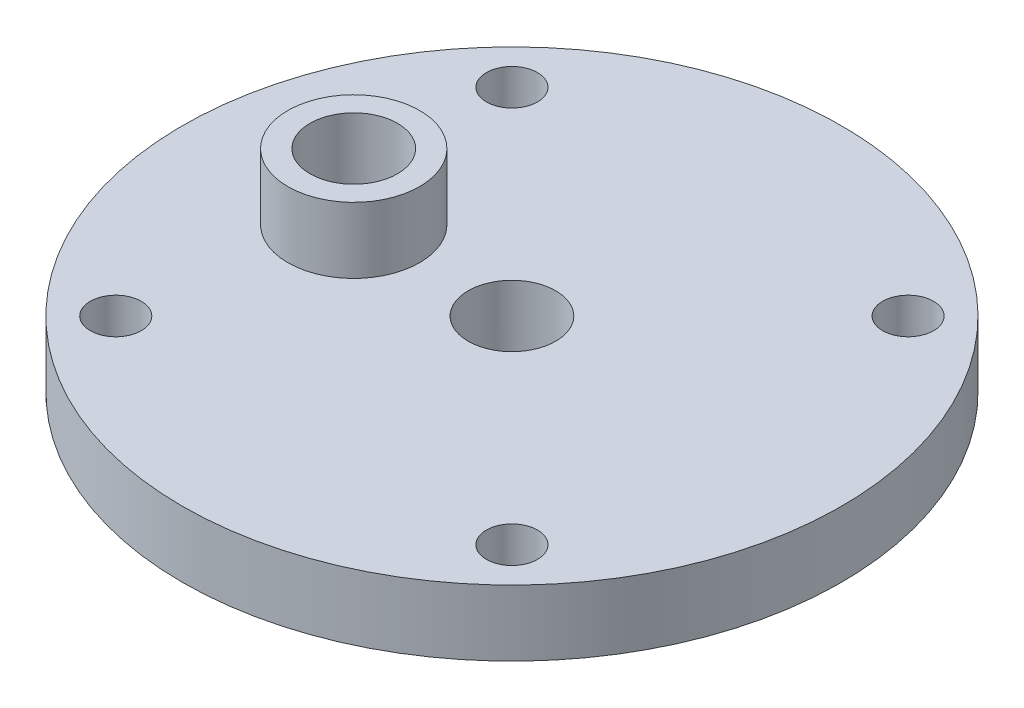
ISO-10303-21;
HEADER;
FILE_DESCRIPTION(('STEP AP214'),'2;1');
FILE_NAME('part.step','',(''),(''),'','','');
FILE_SCHEMA(('AUTOMOTIVE_DESIGN { 1 0 10303 214 1 1 1 1 }'));
ENDSEC;
DATA;
#1=APPLICATION_CONTEXT('core data for automotive mechanical design processes');
#2=APPLICATION_PROTOCOL_DEFINITION('international standard','automotive_design',2000,#1);
#3=PRODUCT_CONTEXT('',#1,'mechanical');
#4=PRODUCT('Part','Part','',(#3));
#5=PRODUCT_RELATED_PRODUCT_CATEGORY('part','',(#4));
#6=PRODUCT_DEFINITION_FORMATION('','',#4);
#7=PRODUCT_DEFINITION_CONTEXT('part definition',#1,'design');
#8=PRODUCT_DEFINITION('design','',#6,#7);
#9=PRODUCT_DEFINITION_SHAPE('','',#8);
#10=(LENGTH_UNIT() NAMED_UNIT(*) SI_UNIT(.MILLI.,.METRE.));
#11=(NAMED_UNIT(*) PLANE_ANGLE_UNIT() SI_UNIT($,.RADIAN.));
#12=(NAMED_UNIT(*) SI_UNIT($,.STERADIAN.) SOLID_ANGLE_UNIT());
#13=UNCERTAINTY_MEASURE_WITH_UNIT(LENGTH_MEASURE(1.E-05),#10,'distance_accuracy_value','');
#14=(GEOMETRIC_REPRESENTATION_CONTEXT(3) GLOBAL_UNCERTAINTY_ASSIGNED_CONTEXT((#13)) GLOBAL_UNIT_ASSIGNED_CONTEXT((#10,
#11,#12)) REPRESENTATION_CONTEXT('',''));
#15=CARTESIAN_POINT('',(0.,0.,0.));
#16=DIRECTION('',(0.,0.,1.));
#17=DIRECTION('',(1.,0.,0.));
#18=AXIS2_PLACEMENT_3D('',#15,#16,#17);
#19=CARTESIAN_POINT('',(0.,0.,0.));
#20=DIRECTION('',(0.,-1.,0.));
#21=DIRECTION('',(0.,0.,-1.));
#22=AXIS2_PLACEMENT_3D('',#19,#20,#21);
#23=PLANE('',#22);
#24=CARTESIAN_POINT('',(0.,0.,-6.34999999999999));
#25=DIRECTION('',(0.,-1.,0.));
#26=DIRECTION('',(0.,0.,-1.));
#27=AXIS2_PLACEMENT_3D('',#24,#25,#26);
#28=ELLIPSE('',#27,0.359210244842765,0.253999999999999);
#29=CARTESIAN_POINT('',(0.,0.,-6.70921024484276));
#30=VERTEX_POINT('',#29);
#31=EDGE_CURVE('E189',#30,#30,#28,.T.);
#32=ORIENTED_EDGE('',*,*,#31,.F.);
#33=EDGE_LOOP('',(#32));
#34=FACE_BOUND('',#33,.T.);
#35=CARTESIAN_POINT('',(-6.34999999999999,0.,0.));
#36=DIRECTION('',(0.,-1.,0.));
#37=DIRECTION('',(-1.,0.,0.));
#38=AXIS2_PLACEMENT_3D('',#35,#36,#37);
#39=ELLIPSE('',#38,0.359210244842765,0.253999999999999);
#40=CARTESIAN_POINT('',(-6.70921024484276,0.,0.));
#41=VERTEX_POINT('',#40);
#42=EDGE_CURVE('E193',#41,#41,#39,.T.);
#43=ORIENTED_EDGE('',*,*,#42,.F.);
#44=EDGE_LOOP('',(#43));
#45=FACE_BOUND('',#44,.T.);
#46=CARTESIAN_POINT('',(0.,0.,6.34999999999999));
#47=DIRECTION('',(0.,-1.,0.));
#48=DIRECTION('',(0.,0.,1.));
#49=AXIS2_PLACEMENT_3D('',#46,#47,#48);
#50=ELLIPSE('',#49,0.359210244842765,0.253999999999999);
#51=CARTESIAN_POINT('',(0.,0.,6.70921024484276));
#52=VERTEX_POINT('',#51);
#53=EDGE_CURVE('E197',#52,#52,#50,.T.);
#54=ORIENTED_EDGE('',*,*,#53,.F.);
#55=EDGE_LOOP('',(#54));
#56=FACE_BOUND('',#55,.T.);
#57=CARTESIAN_POINT('',(6.34999999999999,0.,0.));
#58=DIRECTION('',(0.,-1.,0.));
#59=DIRECTION('',(1.,0.,0.));
#60=AXIS2_PLACEMENT_3D('',#57,#58,#59);
#61=ELLIPSE('',#60,0.359210244842765,0.253999999999999);
#62=CARTESIAN_POINT('',(6.70921024484276,0.,0.));
#63=VERTEX_POINT('',#62);
#64=EDGE_CURVE('E201',#63,#63,#61,.T.);
#65=ORIENTED_EDGE('',*,*,#64,.F.);
#66=EDGE_LOOP('',(#65));
#67=FACE_BOUND('',#66,.T.);
#68=CARTESIAN_POINT('',(0.,0.,0.));
#69=DIRECTION('',(0.,-1.,0.));
#70=DIRECTION('',(0.,0.,-1.));
#71=AXIS2_PLACEMENT_3D('',#68,#69,#70);
#72=CIRCLE('',#71,4.21639999999999);
#73=CARTESIAN_POINT('',(0.,0.,-4.21639999999999));
#74=VERTEX_POINT('',#73);
#75=EDGE_CURVE('E205',#74,#74,#72,.T.);
#76=ORIENTED_EDGE('',*,*,#75,.F.);
#77=EDGE_LOOP('',(#76));
#78=FACE_BOUND('',#77,.T.);
#79=CARTESIAN_POINT('',(0.,0.,0.));
#80=DIRECTION('',(0.,1.,0.));
#81=DIRECTION('',(0.,0.,1.));
#82=AXIS2_PLACEMENT_3D('',#79,#80,#81);
#83=CIRCLE('',#82,15.875);
#84=CARTESIAN_POINT('',(0.,0.,15.875));
#85=VERTEX_POINT('',#84);
#86=EDGE_CURVE('E123',#85,#85,#83,.T.);
#87=ORIENTED_EDGE('',*,*,#86,.F.);
#88=EDGE_LOOP('',(#87));
#89=FACE_BOUND('',#88,.T.);
#90=ADVANCED_FACE('F41',(#34,#45,#56,#67,#78,#89),#23,.T.);
#91=CARTESIAN_POINT('',(0.,14.2875,0.));
#92=DIRECTION('',(0.,1.,0.));
#93=DIRECTION('',(0.,0.,1.));
#94=AXIS2_PLACEMENT_3D('',#91,#92,#93);
#95=CYLINDRICAL_SURFACE('',#94,15.875);
#96=ORIENTED_EDGE('',*,*,#86,.T.);
#97=EDGE_LOOP('',(#96));
#98=FACE_BOUND('',#97,.T.);
#99=CARTESIAN_POINT('',(0.,3.175,0.));
#100=DIRECTION('',(0.,1.,0.));
#101=DIRECTION('',(0.,0.,1.));
#102=AXIS2_PLACEMENT_3D('',#99,#100,#101);
#103=CIRCLE('',#102,15.875);
#104=CARTESIAN_POINT('',(0.,3.175,15.875));
#105=VERTEX_POINT('',#104);
#106=EDGE_CURVE('E119',#105,#105,#103,.T.);
#107=ORIENTED_EDGE('',*,*,#106,.F.);
#108=EDGE_LOOP('',(#107));
#109=FACE_BOUND('',#108,.T.);
#110=ADVANCED_FACE('F179',(#98,#109),#95,.T.);
#111=CARTESIAN_POINT('',(-15.875,3.175,0.));
#112=DIRECTION('',(0.,1.,0.));
#113=DIRECTION('',(0.,0.,1.));
#114=AXIS2_PLACEMENT_3D('',#111,#112,#113);
#115=PLANE('',#114);
#116=CARTESIAN_POINT('',(0.,3.175,-9.52499999999999));
#117=DIRECTION('',(0.,1.,0.));
#118=DIRECTION('',(0.,0.,-1.));
#119=AXIS2_PLACEMENT_3D('',#116,#117,#118);
#120=ELLIPSE('',#119,0.359210244842765,0.253999999999999);
#121=CARTESIAN_POINT('',(0.253988708852886,3.175,-9.52161303224276));
#122=VERTEX_POINT('',#121);
#123=CARTESIAN_POINT('',(-0.253988708852687,3.175,-9.52161303224277));
#124=VERTEX_POINT('',#123);
#125=EDGE_CURVE('E61',#122,#124,#120,.T.);
#126=ORIENTED_EDGE('',*,*,#125,.F.);
#127=CARTESIAN_POINT('',(0.,3.175,0.));
#128=DIRECTION('',(0.,1.,0.));
#129=DIRECTION('',(0.,0.,1.));
#130=AXIS2_PLACEMENT_3D('',#127,#128,#129);
#131=CIRCLE('',#130,9.525);
#132=CARTESIAN_POINT('',(9.52161303224277,3.175,-0.253988708852786));
#133=VERTEX_POINT('',#132);
#134=EDGE_CURVE('E116',#133,#122,#131,.T.);
#135=ORIENTED_EDGE('',*,*,#134,.F.);
#136=CARTESIAN_POINT('',(9.52499999999999,3.175,0.));
#137=DIRECTION('',(0.,1.,0.));
#138=DIRECTION('',(1.,0.,0.));
#139=AXIS2_PLACEMENT_3D('',#136,#137,#138);
#140=ELLIPSE('',#139,0.359210244842765,0.253999999999999);
#141=CARTESIAN_POINT('',(9.52161303224277,3.175,0.253988708852786));
#142=VERTEX_POINT('',#141);
#143=EDGE_CURVE('E224',#142,#133,#140,.T.);
#144=ORIENTED_EDGE('',*,*,#143,.F.);
#145=CARTESIAN_POINT('',(0.253988708852753,3.175,9.52161303224277));
#146=VERTEX_POINT('',#145);
#147=EDGE_CURVE('E110',#146,#142,#131,.T.);
#148=ORIENTED_EDGE('',*,*,#147,.F.);
#149=CARTESIAN_POINT('',(0.,3.175,9.52499999999999));
#150=DIRECTION('',(0.,1.,0.));
#151=DIRECTION('',(0.,0.,1.));
#152=AXIS2_PLACEMENT_3D('',#149,#150,#151);
#153=ELLIPSE('',#152,0.359210244842765,0.253999999999999);
#154=CARTESIAN_POINT('',(-0.25398870885282,3.175,9.52161303224276));
#155=VERTEX_POINT('',#154);
#156=EDGE_CURVE('E229',#155,#146,#153,.T.);
#157=ORIENTED_EDGE('',*,*,#156,.F.);
#158=CARTESIAN_POINT('',(-9.52161303224277,3.175,0.253988708852786));
#159=VERTEX_POINT('',#158);
#160=EDGE_CURVE('E339',#159,#155,#131,.T.);
#161=ORIENTED_EDGE('',*,*,#160,.F.);
#162=CARTESIAN_POINT('',(-9.52499999999999,3.175,0.));
#163=DIRECTION('',(0.,1.,0.));
#164=DIRECTION('',(-1.,0.,0.));
#165=AXIS2_PLACEMENT_3D('',#162,#163,#164);
#166=ELLIPSE('',#165,0.359210244842765,0.253999999999999);
#167=CARTESIAN_POINT('',(-9.52161303224277,3.175,-0.253988708852786));
#168=VERTEX_POINT('',#167);
#169=EDGE_CURVE('E249',#168,#159,#166,.T.);
#170=ORIENTED_EDGE('',*,*,#169,.F.);
#171=EDGE_CURVE('E120',#124,#168,#131,.T.);
#172=ORIENTED_EDGE('',*,*,#171,.F.);
#173=EDGE_LOOP('',(#126,#135,#144,#148,#157,#161,#170,#172));
#174=FACE_BOUND('',#173,.T.);
#175=ORIENTED_EDGE('',*,*,#106,.T.);
#176=EDGE_LOOP('',(#175));
#177=FACE_BOUND('',#176,.T.);
#178=ADVANCED_FACE('F176',(#174,#177),#115,.T.);
#179=CARTESIAN_POINT('',(0.,14.2875,0.));
#180=DIRECTION('',(0.,1.,0.));
#181=DIRECTION('',(0.,0.,1.));
#182=AXIS2_PLACEMENT_3D('',#179,#180,#181);
#183=CYLINDRICAL_SURFACE('',#182,9.525);
#184=CARTESIAN_POINT('',(-0.253988708852687,3.175,-9.52161303224277));
#185=CARTESIAN_POINT('',(-0.253762310380255,3.20265585750623,-9.52161504756113));
#186=CARTESIAN_POINT('',(-0.251352995068558,3.23039204658245,-9.52168301476661));
#187=CARTESIAN_POINT('',(-0.241853833190986,3.28533392360139,-9.52193133421066));
#188=CARTESIAN_POINT('',(-0.234715918134479,3.31253117755965,-9.5221128395515));
#189=CARTESIAN_POINT('',(-0.218358164602399,3.35713046459756,-9.5224989014196));
#190=CARTESIAN_POINT('',(-0.210424196374653,3.37500378633972,-9.52267981537316));
#191=CARTESIAN_POINT('',(-0.191940447112796,3.40930477629347,-9.52307043721314));
#192=CARTESIAN_POINT('',(-0.181399952222309,3.42573730195421,-9.5232800417264));
#193=CARTESIAN_POINT('',(-0.16072081194238,3.45229524343193,-9.52364790521498));
#194=CARTESIAN_POINT('',(-0.151236194408672,3.46292848395282,-9.52380481588724));
#195=CARTESIAN_POINT('',(-0.130716631136981,3.48259108965602,-9.52410852403132));
#196=CARTESIAN_POINT('',(-0.119683543210044,3.49162234787972,-9.52425533331249));
#197=CARTESIAN_POINT('',(-0.0986009468671517,3.50585400616589,-9.52449418016102));
#198=CARTESIAN_POINT('',(-0.0888270926466748,3.51146054985754,-9.52459125353317));
#199=CARTESIAN_POINT('',(-0.0684867399872461,3.52099509660636,-9.52475919099708));
#200=CARTESIAN_POINT('',(-0.0579208147797949,3.52492430004839,-9.52483007382715));
#201=CARTESIAN_POINT('',(-0.0361677863760888,3.53083391022371,-9.52493757139543));
#202=CARTESIAN_POINT('',(-0.0249768337323059,3.53280040261146,-9.52497394137182));
#203=CARTESIAN_POINT('',(-0.00242574338453218,3.53455440588581,-9.52500634993189));
#204=CARTESIAN_POINT('',(0.00893431429477872,3.53434291664427,-9.52500240702251));
#205=CARTESIAN_POINT('',(0.0301416603854675,3.53191109454994,-9.52495755460249));
#206=CARTESIAN_POINT('',(0.0400161323698642,3.52991789763793,-9.5249208254699));
#207=CARTESIAN_POINT('',(0.0593147600747716,3.52437600476957,-9.52482020620429));
#208=CARTESIAN_POINT('',(0.0687388255064597,3.52082699837295,-9.52475631065067));
#209=CARTESIAN_POINT('',(0.0873967849019367,3.51217909651797,-9.52460383298033));
#210=CARTESIAN_POINT('',(0.0965994625743298,3.50701357075855,-9.52451420679547));
#211=CARTESIAN_POINT('',(0.114201058188755,3.49546698046043,-9.52431943572887));
#212=CARTESIAN_POINT('',(0.122599552060628,3.48908527984248,-9.52421428273287));
#213=CARTESIAN_POINT('',(0.143154502534424,3.47138090609201,-9.52393251139403));
#214=CARTESIAN_POINT('',(0.154686131902399,3.45933074890186,-9.52374964140267));
#215=CARTESIAN_POINT('',(0.175688377065705,3.43354540149817,-9.5233853842257));
#216=CARTESIAN_POINT('',(0.185153417622517,3.41980580569167,-9.52320400229142));
#217=CARTESIAN_POINT('',(0.205495145645364,3.38550286469517,-9.52279047636847));
#218=CARTESIAN_POINT('',(0.215446560774838,3.36439191301757,-9.52256667442027));
#219=CARTESIAN_POINT('',(0.231869175287278,3.32086299206787,-9.52218086016359));
#220=CARTESIAN_POINT('',(0.238335691826847,3.29844330876932,-9.5220189310815));
#221=CARTESIAN_POINT('',(0.2466866766919,3.2590999999945,-9.52180566013396));
#222=CARTESIAN_POINT('',(0.249337943823236,3.24233328879731,-9.5217362419771));
#223=CARTESIAN_POINT('',(0.252924775501788,3.20871213745041,-9.52164140518111));
#224=CARTESIAN_POINT('',(0.253869940229587,3.19185872674099,-9.52161574038898));
#225=CARTESIAN_POINT('',(0.253988708852886,3.175,-9.52161303224276));
#226=B_SPLINE_CURVE_WITH_KNOTS('',3,(#184,#185,#186,#187,#188,#189,#190,#191,#192,#193,#194,
#195,#196,#197,#198,#199,#200,#201,#202,#203,#204,#205,#206,#207,#208,#209,#210,#211,#212,#213,
#214,#215,#216,#217,#218,#219,#220,#221,#222,#223,#224,#225),.UNSPECIFIED.,.F.,.F.,(4,2,2,2,2,2,
2,2,2,2,2,2,2,2,2,2,2,2,2,2,4),(0.,0.0830489779831655,0.166955416075598,0.225441836053683,
0.2837228177842,0.326332802552292,0.368892095272986,0.402564876039762,0.436213518391679,
0.470099048513841,0.503969023097582,0.534053919690414,0.564144822042937,0.595690364106974,
0.627252450509459,0.677010263021198,0.726900697383764,0.796547864387975,0.866288388098834,
0.917131095401339,0.967686809951884),.UNSPECIFIED.);
#227=EDGE_CURVE('E48',#124,#122,#226,.T.);
#228=ORIENTED_EDGE('',*,*,#227,.F.);
#229=ORIENTED_EDGE('',*,*,#171,.T.);
#230=CARTESIAN_POINT('',(-9.52161303224277,3.175,0.253988708852786));
#231=CARTESIAN_POINT('',(-9.52161504756113,3.20265585750623,0.253762310380354));
#232=CARTESIAN_POINT('',(-9.52168301476661,3.23039204658245,0.251352995068657));
#233=CARTESIAN_POINT('',(-9.52193133421066,3.2853339236014,0.241853833191085));
#234=CARTESIAN_POINT('',(-9.5221128395515,3.31253117755965,0.234715918134578));
#235=CARTESIAN_POINT('',(-9.5224989014196,3.35713046459757,0.218358164602498));
#236=CARTESIAN_POINT('',(-9.52267981537315,3.37500378633972,0.21042419637475));
#237=CARTESIAN_POINT('',(-9.52307043721313,3.40930477629347,0.191940447112894));
#238=CARTESIAN_POINT('',(-9.5232800417264,3.42573730195422,0.181399952222408));
#239=CARTESIAN_POINT('',(-9.52364790521498,3.45229524343193,0.160720811942479));
#240=CARTESIAN_POINT('',(-9.52380481588724,3.46292848395282,0.151236194408771));
#241=CARTESIAN_POINT('',(-9.52410852403132,3.48259108965602,0.130716631137079));
#242=CARTESIAN_POINT('',(-9.52425533331249,3.49162234787972,0.119683543210142));
#243=CARTESIAN_POINT('',(-9.52449418016102,3.50585400616589,0.0986009468672503));
#244=CARTESIAN_POINT('',(-9.52459125353317,3.51146054985754,0.0888270926467736));
#245=CARTESIAN_POINT('',(-9.52475919099708,3.52099509660636,0.0684867399873451));
#246=CARTESIAN_POINT('',(-9.52483007382715,3.52492430004839,0.0579208147798937));
#247=CARTESIAN_POINT('',(-9.52493757139542,3.53083391022371,0.036167786376188));
#248=CARTESIAN_POINT('',(-9.52497394137182,3.53280040261146,0.0249768337324055));
#249=CARTESIAN_POINT('',(-9.5250063499319,3.53455440588581,0.00242574338463219));
#250=CARTESIAN_POINT('',(-9.52500240702251,3.53434291664427,-0.00893431429467862));
#251=CARTESIAN_POINT('',(-9.52495755460249,3.53191109454994,-0.0301416603853672));
#252=CARTESIAN_POINT('',(-9.5249208254699,3.52991789763793,-0.0400161323697638));
#253=CARTESIAN_POINT('',(-9.52482020620429,3.52437600476957,-0.0593147600746713));
#254=CARTESIAN_POINT('',(-9.52475631065067,3.52082699837295,-0.0687388255063596));
#255=CARTESIAN_POINT('',(-9.52460383298033,3.51217909651798,-0.0873967849018369));
#256=CARTESIAN_POINT('',(-9.52451420679547,3.50701357075856,-0.0965994625742299));
#257=CARTESIAN_POINT('',(-9.52431943572887,3.49546698046043,-0.114201058188655));
#258=CARTESIAN_POINT('',(-9.52421428273287,3.48908527984248,-0.122599552060528));
#259=CARTESIAN_POINT('',(-9.52393251139404,3.47138090609201,-0.143154502534324));
#260=CARTESIAN_POINT('',(-9.52374964140267,3.45933074890186,-0.1546861319023));
#261=CARTESIAN_POINT('',(-9.5233853842257,3.43354540149817,-0.175688377065605));
#262=CARTESIAN_POINT('',(-9.52320400229142,3.41980580569167,-0.185153417622418));
#263=CARTESIAN_POINT('',(-9.52279047636847,3.38550286469517,-0.205495145645264));
#264=CARTESIAN_POINT('',(-9.52256667442027,3.36439191301757,-0.215446560774739));
#265=CARTESIAN_POINT('',(-9.52218086016359,3.32086299206787,-0.231869175287179));
#266=CARTESIAN_POINT('',(-9.52201893108151,3.29844330876932,-0.238335691826748));
#267=CARTESIAN_POINT('',(-9.52180566013396,3.2590999999945,-0.246686676691801));
#268=CARTESIAN_POINT('',(-9.5217362419771,3.24233328879731,-0.249337943823137));
#269=CARTESIAN_POINT('',(-9.52164140518112,3.20871213745041,-0.252924775501688));
#270=CARTESIAN_POINT('',(-9.52161574038898,3.19185872674099,-0.253869940229487));
#271=CARTESIAN_POINT('',(-9.52161303224276,3.175,-0.253988708852786));
#272=B_SPLINE_CURVE_WITH_KNOTS('',3,(#230,#231,#232,#233,#234,#235,#236,#237,#238,#239,#240,
#241,#242,#243,#244,#245,#246,#247,#248,#249,#250,#251,#252,#253,#254,#255,#256,#257,#258,#259,
#260,#261,#262,#263,#264,#265,#266,#267,#268,#269,#270,#271),.UNSPECIFIED.,.F.,.F.,(4,2,2,2,2,2,
2,2,2,2,2,2,2,2,2,2,2,2,2,2,4),(0.,0.0830489779831668,0.166955416075601,0.225441836053685,
0.283722817784202,0.326332802552293,0.368892095272987,0.402564876039763,0.436213518391679,
0.47009904851384,0.503969023097581,0.534053919690413,0.564144822042936,0.595690364106973,
0.627252450509458,0.677010263021198,0.726900697383764,0.796547864387975,0.866288388098834,
0.917131095401339,0.967686809951884),.UNSPECIFIED.);
#273=EDGE_CURVE('E328',#159,#168,#272,.T.);
#274=ORIENTED_EDGE('',*,*,#273,.F.);
#275=ORIENTED_EDGE('',*,*,#160,.T.);
#276=CARTESIAN_POINT('',(0.253988708852753,3.175,9.52161303224277));
#277=CARTESIAN_POINT('',(0.253762310380322,3.20265585750623,9.52161504756113));
#278=CARTESIAN_POINT('',(0.251352995068624,3.23039204658245,9.52168301476661));
#279=CARTESIAN_POINT('',(0.241853833191052,3.2853339236014,9.52193133421066));
#280=CARTESIAN_POINT('',(0.234715918134545,3.31253117755965,9.5221128395515));
#281=CARTESIAN_POINT('',(0.218358164602465,3.35713046459757,9.5224989014196));
#282=CARTESIAN_POINT('',(0.210424196374718,3.37500378633972,9.52267981537315));
#283=CARTESIAN_POINT('',(0.191940447112861,3.40930477629347,9.52307043721313));
#284=CARTESIAN_POINT('',(0.181399952222375,3.42573730195422,9.5232800417264));
#285=CARTESIAN_POINT('',(0.160720811942446,3.45229524343193,9.52364790521498));
#286=CARTESIAN_POINT('',(0.151236194408738,3.46292848395282,9.52380481588724));
#287=CARTESIAN_POINT('',(0.130716631137047,3.48259108965602,9.52410852403132));
#288=CARTESIAN_POINT('',(0.11968354321011,3.49162234787972,9.52425533331249));
#289=CARTESIAN_POINT('',(0.0986009468672178,3.50585400616589,9.52449418016102));
#290=CARTESIAN_POINT('',(0.0888270926467405,3.51146054985754,9.52459125353317));
#291=CARTESIAN_POINT('',(0.0684867399873118,3.52099509660636,9.52475919099708));
#292=CARTESIAN_POINT('',(0.0579208147798607,3.52492430004839,9.52483007382715));
#293=CARTESIAN_POINT('',(0.0361677863761551,3.53083391022371,9.52493757139542));
#294=CARTESIAN_POINT('',(0.0249768337323725,3.53280040261145,9.52497394137182));
#295=CARTESIAN_POINT('',(0.0024257433845991,3.53455440588581,9.5250063499319));
#296=CARTESIAN_POINT('',(-0.00893431429471164,3.53434291664427,9.52500240702251));
#297=CARTESIAN_POINT('',(-0.0301416603854002,3.53191109454994,9.52495755460249));
#298=CARTESIAN_POINT('',(-0.040016132369797,3.52991789763793,9.5249208254699));
#299=CARTESIAN_POINT('',(-0.0593147600747045,3.52437600476957,9.52482020620429));
#300=CARTESIAN_POINT('',(-0.0687388255063927,3.52082699837295,9.52475631065067));
#301=CARTESIAN_POINT('',(-0.0873967849018698,3.51217909651797,9.52460383298033));
#302=CARTESIAN_POINT('',(-0.0965994625742628,3.50701357075855,9.52451420679547));
#303=CARTESIAN_POINT('',(-0.114201058188688,3.49546698046043,9.52431943572887));
#304=CARTESIAN_POINT('',(-0.122599552060562,3.48908527984248,9.52421428273287));
#305=CARTESIAN_POINT('',(-0.143154502534358,3.47138090609201,9.52393251139404));
#306=CARTESIAN_POINT('',(-0.154686131902333,3.45933074890186,9.52374964140267));
#307=CARTESIAN_POINT('',(-0.175688377065639,3.43354540149817,9.5233853842257));
#308=CARTESIAN_POINT('',(-0.185153417622451,3.41980580569167,9.52320400229142));
#309=CARTESIAN_POINT('',(-0.205495145645298,3.38550286469517,9.52279047636847));
#310=CARTESIAN_POINT('',(-0.215446560774773,3.36439191301757,9.52256667442027));
#311=CARTESIAN_POINT('',(-0.231869175287212,3.32086299206787,9.52218086016359));
#312=CARTESIAN_POINT('',(-0.238335691826781,3.29844330876932,9.5220189310815));
#313=CARTESIAN_POINT('',(-0.246686676691834,3.2590999999945,9.52180566013396));
#314=CARTESIAN_POINT('',(-0.24933794382317,3.24233328879731,9.5217362419771));
#315=CARTESIAN_POINT('',(-0.252924775501721,3.20871213745041,9.52164140518112));
#316=CARTESIAN_POINT('',(-0.25386994022952,3.19185872674099,9.52161574038898));
#317=CARTESIAN_POINT('',(-0.253988708852819,3.175,9.52161303224276));
#318=B_SPLINE_CURVE_WITH_KNOTS('',3,(#276,#277,#278,#279,#280,#281,#282,#283,#284,#285,#286,
#287,#288,#289,#290,#291,#292,#293,#294,#295,#296,#297,#298,#299,#300,#301,#302,#303,#304,#305,
#306,#307,#308,#309,#310,#311,#312,#313,#314,#315,#316,#317),.UNSPECIFIED.,.F.,.F.,(4,2,2,2,2,2,
2,2,2,2,2,2,2,2,2,2,2,2,2,2,4),(0.,0.0830489779831668,0.1669554160756,0.225441836053685,
0.283722817784202,0.326332802552293,0.368892095272987,0.402564876039763,0.436213518391679,
0.47009904851384,0.503969023097581,0.534053919690413,0.564144822042937,0.595690364106974,
0.627252450509458,0.677010263021199,0.726900697383764,0.796547864387976,0.866288388098835,
0.917131095401339,0.967686809951884),.UNSPECIFIED.);
#319=EDGE_CURVE('E135',#146,#155,#318,.T.);
#320=ORIENTED_EDGE('',*,*,#319,.F.);
#321=ORIENTED_EDGE('',*,*,#147,.T.);
#322=CARTESIAN_POINT('',(9.52161303224277,3.175,-0.253988708852786));
#323=CARTESIAN_POINT('',(9.52161504756113,3.20265585750623,-0.253762310380354));
#324=CARTESIAN_POINT('',(9.52168301476661,3.23039204658245,-0.251352995068657));
#325=CARTESIAN_POINT('',(9.52193133421066,3.2853339236014,-0.241853833191085));
#326=CARTESIAN_POINT('',(9.5221128395515,3.31253117755965,-0.234715918134578));
#327=CARTESIAN_POINT('',(9.5224989014196,3.35713046459757,-0.218358164602498));
#328=CARTESIAN_POINT('',(9.52267981537315,3.37500378633972,-0.21042419637475));
#329=CARTESIAN_POINT('',(9.52307043721313,3.40930477629347,-0.191940447112894));
#330=CARTESIAN_POINT('',(9.5232800417264,3.42573730195422,-0.181399952222408));
#331=CARTESIAN_POINT('',(9.52364790521498,3.45229524343193,-0.160720811942479));
#332=CARTESIAN_POINT('',(9.52380481588724,3.46292848395282,-0.151236194408771));
#333=CARTESIAN_POINT('',(9.52410852403132,3.48259108965602,-0.130716631137079));
#334=CARTESIAN_POINT('',(9.52425533331249,3.49162234787972,-0.119683543210142));
#335=CARTESIAN_POINT('',(9.52449418016102,3.50585400616589,-0.0986009468672503));
#336=CARTESIAN_POINT('',(9.52459125353317,3.51146054985754,-0.0888270926467736));
#337=CARTESIAN_POINT('',(9.52475919099708,3.52099509660636,-0.0684867399873451));
#338=CARTESIAN_POINT('',(9.52483007382715,3.52492430004839,-0.0579208147798937));
#339=CARTESIAN_POINT('',(9.52493757139542,3.53083391022371,-0.036167786376188));
#340=CARTESIAN_POINT('',(9.52497394137182,3.53280040261146,-0.0249768337324055));
#341=CARTESIAN_POINT('',(9.5250063499319,3.53455440588581,-0.00242574338463219));
#342=CARTESIAN_POINT('',(9.52500240702251,3.53434291664427,0.00893431429467862));
#343=CARTESIAN_POINT('',(9.52495755460249,3.53191109454994,0.0301416603853672));
#344=CARTESIAN_POINT('',(9.5249208254699,3.52991789763793,0.0400161323697638));
#345=CARTESIAN_POINT('',(9.52482020620429,3.52437600476957,0.0593147600746713));
#346=CARTESIAN_POINT('',(9.52475631065067,3.52082699837295,0.0687388255063596));
#347=CARTESIAN_POINT('',(9.52460383298033,3.51217909651798,0.0873967849018369));
#348=CARTESIAN_POINT('',(9.52451420679547,3.50701357075856,0.0965994625742299));
#349=CARTESIAN_POINT('',(9.52431943572887,3.49546698046043,0.114201058188655));
#350=CARTESIAN_POINT('',(9.52421428273287,3.48908527984248,0.122599552060528));
#351=CARTESIAN_POINT('',(9.52393251139404,3.47138090609201,0.143154502534324));
#352=CARTESIAN_POINT('',(9.52374964140267,3.45933074890186,0.1546861319023));
#353=CARTESIAN_POINT('',(9.5233853842257,3.43354540149817,0.175688377065605));
#354=CARTESIAN_POINT('',(9.52320400229142,3.41980580569167,0.185153417622418));
#355=CARTESIAN_POINT('',(9.52279047636847,3.38550286469517,0.205495145645264));
#356=CARTESIAN_POINT('',(9.52256667442027,3.36439191301757,0.215446560774739));
#357=CARTESIAN_POINT('',(9.52218086016359,3.32086299206787,0.231869175287179));
#358=CARTESIAN_POINT('',(9.52201893108151,3.29844330876932,0.238335691826748));
#359=CARTESIAN_POINT('',(9.52180566013396,3.2590999999945,0.246686676691801));
#360=CARTESIAN_POINT('',(9.5217362419771,3.24233328879731,0.249337943823137));
#361=CARTESIAN_POINT('',(9.52164140518112,3.20871213745041,0.252924775501688));
#362=CARTESIAN_POINT('',(9.52161574038898,3.19185872674099,0.253869940229487));
#363=CARTESIAN_POINT('',(9.52161303224276,3.175,0.253988708852786));
#364=B_SPLINE_CURVE_WITH_KNOTS('',3,(#322,#323,#324,#325,#326,#327,#328,#329,#330,#331,#332,
#333,#334,#335,#336,#337,#338,#339,#340,#341,#342,#343,#344,#345,#346,#347,#348,#349,#350,#351,
#352,#353,#354,#355,#356,#357,#358,#359,#360,#361,#362,#363),.UNSPECIFIED.,.F.,.F.,(4,2,2,2,2,2,
2,2,2,2,2,2,2,2,2,2,2,2,2,2,4),(0.,0.0830489779831668,0.166955416075601,0.225441836053685,
0.283722817784202,0.326332802552293,0.368892095272987,0.402564876039763,0.436213518391679,
0.47009904851384,0.503969023097581,0.534053919690413,0.564144822042936,0.595690364106973,
0.627252450509458,0.677010263021198,0.726900697383764,0.796547864387975,0.866288388098834,
0.917131095401339,0.967686809951884),.UNSPECIFIED.);
#365=EDGE_CURVE('E126',#133,#142,#364,.T.);
#366=ORIENTED_EDGE('',*,*,#365,.F.);
#367=ORIENTED_EDGE('',*,*,#134,.T.);
#368=EDGE_LOOP('',(#228,#229,#274,#275,#320,#321,#366,#367));
#369=FACE_BOUND('',#368,.T.);
#370=CARTESIAN_POINT('',(0.,6.35,0.));
#371=DIRECTION('',(0.,1.,0.));
#372=DIRECTION('',(0.,0.,1.));
#373=AXIS2_PLACEMENT_3D('',#370,#371,#372);
#374=CIRCLE('',#373,9.525);
#375=CARTESIAN_POINT('',(0.,6.35,9.525));
#376=VERTEX_POINT('',#375);
#377=EDGE_CURVE('E107',#376,#376,#374,.T.);
#378=ORIENTED_EDGE('',*,*,#377,.F.);
#379=EDGE_LOOP('',(#378));
#380=FACE_BOUND('',#379,.T.);
#381=ADVANCED_FACE('F142',(#369,#380),#183,.T.);
#382=CARTESIAN_POINT('',(-15.875,6.35,0.));
#383=DIRECTION('',(0.,-1.,0.));
#384=DIRECTION('',(0.,0.,-1.));
#385=AXIS2_PLACEMENT_3D('',#382,#383,#384);
#386=PLANE('',#385);
#387=CARTESIAN_POINT('',(-15.24,6.35,0.));
#388=DIRECTION('',(0.,-1.,0.));
#389=DIRECTION('',(0.,0.,-1.));
#390=AXIS2_PLACEMENT_3D('',#387,#388,#389);
#391=CIRCLE('',#390,1.58749999999999);
#392=CARTESIAN_POINT('',(-15.805546875,6.35,-1.48334519993751));
#393=VERTEX_POINT('',#392);
#394=CARTESIAN_POINT('',(-15.805546875,6.35,1.48334519993753));
#395=VERTEX_POINT('',#394);
#396=EDGE_CURVE('E11',#393,#395,#391,.T.);
#397=ORIENTED_EDGE('',*,*,#396,.F.);
#398=CARTESIAN_POINT('',(0.,6.35,0.));
#399=DIRECTION('',(0.,1.,0.));
#400=DIRECTION('',(0.,0.,1.));
#401=AXIS2_PLACEMENT_3D('',#398,#399,#400);
#402=CIRCLE('',#401,15.875);
#403=EDGE_CURVE('E100',#395,#393,#402,.T.);
#404=ORIENTED_EDGE('',*,*,#403,.F.);
#405=EDGE_LOOP('',(#397,#404));
#406=FACE_BOUND('',#405,.T.);
#407=ORIENTED_EDGE('',*,*,#377,.T.);
#408=EDGE_LOOP('',(#407));
#409=FACE_BOUND('',#408,.T.);
#410=ADVANCED_FACE('F105',(#406,#409),#386,.T.);
#411=CARTESIAN_POINT('',(0.,14.2875,0.));
#412=DIRECTION('',(0.,1.,0.));
#413=DIRECTION('',(0.,0.,1.));
#414=AXIS2_PLACEMENT_3D('',#411,#412,#413);
#415=CYLINDRICAL_SURFACE('',#414,15.875);
#416=DIRECTION('',(0.,1.,0.));
#417=VECTOR('',#416,1.);
#418=CARTESIAN_POINT('',(-15.805546875,13.49375,1.48334519993753));
#419=LINE('',#418,#417);
#420=CARTESIAN_POINT('',(-15.805546875,7.9375,1.48334519993751));
#421=VERTEX_POINT('',#420);
#422=EDGE_CURVE('E92',#395,#421,#419,.T.);
#423=ORIENTED_EDGE('',*,*,#422,.F.);
#424=ORIENTED_EDGE('',*,*,#403,.T.);
#425=DIRECTION('',(0.,1.,0.));
#426=VECTOR('',#425,1.);
#427=CARTESIAN_POINT('',(-15.805546875,13.49375,-1.48334519993753));
#428=LINE('',#427,#426);
#429=CARTESIAN_POINT('',(-15.805546875,7.9375,-1.48334519993751));
#430=VERTEX_POINT('',#429);
#431=EDGE_CURVE('E54',#430,#393,#428,.F.);
#432=ORIENTED_EDGE('',*,*,#431,.F.);
#433=CARTESIAN_POINT('',(0.,7.9375,0.));
#434=DIRECTION('',(0.,1.,0.));
#435=DIRECTION('',(0.,0.,1.));
#436=AXIS2_PLACEMENT_3D('',#433,#434,#435);
#437=CIRCLE('',#436,15.875);
#438=EDGE_CURVE('E102',#421,#430,#437,.T.);
#439=ORIENTED_EDGE('',*,*,#438,.F.);
#440=EDGE_LOOP('',(#423,#424,#432,#439));
#441=FACE_BOUND('',#440,.T.);
#442=ADVANCED_FACE('F99',(#441),#415,.T.);
#443=CARTESIAN_POINT('',(-15.875,7.9375,0.));
#444=DIRECTION('',(0.,-1.,0.));
#445=DIRECTION('',(0.,0.,-1.));
#446=AXIS2_PLACEMENT_3D('',#443,#444,#445);
#447=PLANE('',#446);
#448=CARTESIAN_POINT('',(19.083044257272,7.9375,19.0830442572719));
#449=DIRECTION('',(0.,-1.,0.));
#450=DIRECTION('',(0.,0.,-1.));
#451=AXIS2_PLACEMENT_3D('',#448,#449,#450);
#452=CIRCLE('',#451,2.45745);
#453=CARTESIAN_POINT('',(19.083044257272,7.9375,16.6255942572718));
#454=VERTEX_POINT('',#453);
#455=EDGE_CURVE('E286',#454,#454,#452,.T.);
#456=ORIENTED_EDGE('',*,*,#455,.F.);
#457=EDGE_LOOP('',(#456));
#458=FACE_BOUND('',#457,.T.);
#459=CARTESIAN_POINT('',(-19.0830442572721,7.9375,19.0830442572718));
#460=DIRECTION('',(0.,-1.,0.));
#461=DIRECTION('',(0.,0.,-1.));
#462=AXIS2_PLACEMENT_3D('',#459,#460,#461);
#463=CIRCLE('',#462,2.45745);
#464=CARTESIAN_POINT('',(-19.0830442572721,7.9375,16.6255942572718));
#465=VERTEX_POINT('',#464);
#466=EDGE_CURVE('E280',#465,#465,#463,.T.);
#467=ORIENTED_EDGE('',*,*,#466,.F.);
#468=EDGE_LOOP('',(#467));
#469=FACE_BOUND('',#468,.T.);
#470=CARTESIAN_POINT('',(-19.0830442572719,7.9375,-19.083044257272));
#471=DIRECTION('',(0.,-1.,0.));
#472=DIRECTION('',(0.,0.,-1.));
#473=AXIS2_PLACEMENT_3D('',#470,#471,#472);
#474=CIRCLE('',#473,2.45745);
#475=CARTESIAN_POINT('',(-19.0830442572719,7.9375,-21.540494257272));
#476=VERTEX_POINT('',#475);
#477=EDGE_CURVE('E274',#476,#476,#474,.T.);
#478=ORIENTED_EDGE('',*,*,#477,.F.);
#479=EDGE_LOOP('',(#478));
#480=FACE_BOUND('',#479,.T.);
#481=CARTESIAN_POINT('',(19.0830442572721,7.9375,-19.0830442572718));
#482=DIRECTION('',(0.,-1.,0.));
#483=DIRECTION('',(0.,0.,-1.));
#484=AXIS2_PLACEMENT_3D('',#481,#482,#483);
#485=CIRCLE('',#484,2.45745);
#486=CARTESIAN_POINT('',(19.0830442572721,7.9375,-21.5404942572718));
#487=VERTEX_POINT('',#486);
#488=EDGE_CURVE('E268',#487,#487,#485,.T.);
#489=ORIENTED_EDGE('',*,*,#488,.F.);
#490=EDGE_LOOP('',(#489));
#491=FACE_BOUND('',#490,.T.);
#492=CARTESIAN_POINT('',(-15.24,7.9375,0.));
#493=DIRECTION('',(0.,-1.,0.));
#494=DIRECTION('',(0.,0.,-1.));
#495=AXIS2_PLACEMENT_3D('',#492,#493,#494);
#496=CIRCLE('',#495,1.58749999999999);
#497=EDGE_CURVE('E263',#421,#430,#496,.T.);
#498=ORIENTED_EDGE('',*,*,#497,.F.);
#499=ORIENTED_EDGE('',*,*,#438,.T.);
#500=EDGE_LOOP('',(#498,#499));
#501=FACE_BOUND('',#500,.T.);
#502=CARTESIAN_POINT('',(0.,7.9375,0.));
#503=DIRECTION('',(0.,1.,0.));
#504=DIRECTION('',(0.,0.,1.));
#505=AXIS2_PLACEMENT_3D('',#502,#503,#504);
#506=CIRCLE('',#505,31.75);
#507=CARTESIAN_POINT('',(0.,7.9375,31.75));
#508=VERTEX_POINT('',#507);
#509=EDGE_CURVE('E112',#508,#508,#506,.T.);
#510=ORIENTED_EDGE('',*,*,#509,.F.);
#511=EDGE_LOOP('',(#510));
#512=FACE_BOUND('',#511,.T.);
#513=ADVANCED_FACE('F165',(#458,#469,#480,#491,#501,#512),#447,.T.);
#514=CARTESIAN_POINT('',(0.,14.2875,0.));
#515=DIRECTION('',(0.,1.,0.));
#516=DIRECTION('',(0.,0.,1.));
#517=AXIS2_PLACEMENT_3D('',#514,#515,#516);
#518=CYLINDRICAL_SURFACE('',#517,31.75);
#519=ORIENTED_EDGE('',*,*,#509,.T.);
#520=EDGE_LOOP('',(#519));
#521=FACE_BOUND('',#520,.T.);
#522=CARTESIAN_POINT('',(0.,14.2875,0.));
#523=DIRECTION('',(0.,1.,0.));
#524=DIRECTION('',(0.,0.,1.));
#525=AXIS2_PLACEMENT_3D('',#522,#523,#524);
#526=CIRCLE('',#525,31.75);
#527=CARTESIAN_POINT('',(0.,14.2875,31.75));
#528=VERTEX_POINT('',#527);
#529=EDGE_CURVE('E236',#528,#528,#526,.T.);
#530=ORIENTED_EDGE('',*,*,#529,.F.);
#531=EDGE_LOOP('',(#530));
#532=FACE_BOUND('',#531,.T.);
#533=ADVANCED_FACE('F161',(#521,#532),#518,.T.);
#534=CARTESIAN_POINT('',(-31.75,14.2875,0.));
#535=DIRECTION('',(0.,1.,0.));
#536=DIRECTION('',(0.,0.,1.));
#537=AXIS2_PLACEMENT_3D('',#534,#535,#536);
#538=PLANE('',#537);
#539=CARTESIAN_POINT('',(19.083044257272,14.2875,19.0830442572719));
#540=DIRECTION('',(0.,1.,0.));
#541=DIRECTION('',(0.,0.,1.));
#542=AXIS2_PLACEMENT_3D('',#539,#540,#541);
#543=CIRCLE('',#542,2.45745);
#544=CARTESIAN_POINT('',(19.083044257272,14.2875,21.5404942572718));
#545=VERTEX_POINT('',#544);
#546=EDGE_CURVE('E289',#545,#545,#543,.T.);
#547=ORIENTED_EDGE('',*,*,#546,.F.);
#548=EDGE_LOOP('',(#547));
#549=FACE_BOUND('',#548,.T.);
#550=CARTESIAN_POINT('',(-19.0830442572721,14.2875,19.0830442572718));
#551=DIRECTION('',(0.,1.,0.));
#552=DIRECTION('',(0.,0.,1.));
#553=AXIS2_PLACEMENT_3D('',#550,#551,#552);
#554=CIRCLE('',#553,2.45745);
#555=CARTESIAN_POINT('',(-19.0830442572721,14.2875,21.5404942572718));
#556=VERTEX_POINT('',#555);
#557=EDGE_CURVE('E283',#556,#556,#554,.T.);
#558=ORIENTED_EDGE('',*,*,#557,.F.);
#559=EDGE_LOOP('',(#558));
#560=FACE_BOUND('',#559,.T.);
#561=CARTESIAN_POINT('',(-19.0830442572719,14.2875,-19.083044257272));
#562=DIRECTION('',(0.,1.,0.));
#563=DIRECTION('',(0.,0.,1.));
#564=AXIS2_PLACEMENT_3D('',#561,#562,#563);
#565=CIRCLE('',#564,2.45745);
#566=CARTESIAN_POINT('',(-19.0830442572719,14.2875,-16.625594257272));
#567=VERTEX_POINT('',#566);
#568=EDGE_CURVE('E277',#567,#567,#565,.T.);
#569=ORIENTED_EDGE('',*,*,#568,.F.);
#570=EDGE_LOOP('',(#569));
#571=FACE_BOUND('',#570,.T.);
#572=CARTESIAN_POINT('',(19.0830442572721,14.2875,-19.0830442572718));
#573=DIRECTION('',(0.,1.,0.));
#574=DIRECTION('',(0.,0.,1.));
#575=AXIS2_PLACEMENT_3D('',#572,#573,#574);
#576=CIRCLE('',#575,2.45745);
#577=CARTESIAN_POINT('',(19.0830442572721,14.2875,-16.6255942572718));
#578=VERTEX_POINT('',#577);
#579=EDGE_CURVE('E271',#578,#578,#576,.T.);
#580=ORIENTED_EDGE('',*,*,#579,.F.);
#581=EDGE_LOOP('',(#580));
#582=FACE_BOUND('',#581,.T.);
#583=CARTESIAN_POINT('',(-15.24,14.2875,0.));
#584=DIRECTION('',(0.,1.,0.));
#585=DIRECTION('',(0.,0.,1.));
#586=AXIS2_PLACEMENT_3D('',#583,#584,#585);
#587=CIRCLE('',#586,6.35);
#588=CARTESIAN_POINT('',(-15.24,14.2875,6.35));
#589=VERTEX_POINT('',#588);
#590=EDGE_CURVE('E252',#589,#589,#587,.T.);
#591=ORIENTED_EDGE('',*,*,#590,.F.);
#592=EDGE_LOOP('',(#591));
#593=FACE_BOUND('',#592,.T.);
#594=CARTESIAN_POINT('',(0.,14.2875,0.));
#595=DIRECTION('',(0.,1.,0.));
#596=DIRECTION('',(0.,0.,1.));
#597=AXIS2_PLACEMENT_3D('',#594,#595,#596);
#598=CIRCLE('',#597,4.2164);
#599=CARTESIAN_POINT('',(0.,14.2875,4.2164));
#600=VERTEX_POINT('',#599);
#601=EDGE_CURVE('E227',#600,#600,#598,.T.);
#602=ORIENTED_EDGE('',*,*,#601,.F.);
#603=EDGE_LOOP('',(#602));
#604=FACE_BOUND('',#603,.T.);
#605=ORIENTED_EDGE('',*,*,#529,.T.);
#606=EDGE_LOOP('',(#605));
#607=FACE_BOUND('',#606,.T.);
#608=ADVANCED_FACE('F157',(#549,#560,#571,#582,#593,#604,#607),#538,.T.);
#609=CARTESIAN_POINT('',(0.,14.2875,0.));
#610=DIRECTION('',(0.,1.,0.));
#611=DIRECTION('',(0.,0.,1.));
#612=AXIS2_PLACEMENT_3D('',#609,#610,#611);
#613=CYLINDRICAL_SURFACE('',#612,4.21639999999999);
#614=ORIENTED_EDGE('',*,*,#75,.T.);
#615=EDGE_LOOP('',(#614));
#616=FACE_BOUND('',#615,.T.);
#617=ORIENTED_EDGE('',*,*,#601,.T.);
#618=EDGE_LOOP('',(#617));
#619=FACE_BOUND('',#618,.T.);
#620=ADVANCED_FACE('F151',(#616,#619),#613,.F.);
#621=CARTESIAN_POINT('',(11.5678948775786,5.21789487757861,0.));
#622=DIRECTION('',(0.707106781186547,0.707106781186548,0.));
#623=DIRECTION('',(-0.707106781186548,0.707106781186547,0.));
#624=AXIS2_PLACEMENT_3D('',#621,#622,#623);
#625=CYLINDRICAL_SURFACE('',#624,0.253999999999999);
#626=ORIENTED_EDGE('',*,*,#64,.T.);
#627=EDGE_LOOP('',(#626));
#628=FACE_BOUND('',#627,.T.);
#629=ORIENTED_EDGE('',*,*,#143,.T.);
#630=ORIENTED_EDGE('',*,*,#365,.T.);
#631=EDGE_LOOP('',(#629,#630));
#632=FACE_BOUND('',#631,.T.);
#633=ADVANCED_FACE('F146',(#628,#632),#625,.F.);
#634=CARTESIAN_POINT('',(0.,5.21789487757861,11.5678948775786));
#635=DIRECTION('',(0.,0.707106781186548,0.707106781186547));
#636=DIRECTION('',(0.,0.707106781186547,-0.707106781186548));
#637=AXIS2_PLACEMENT_3D('',#634,#635,#636);
#638=CYLINDRICAL_SURFACE('',#637,0.253999999999999);
#639=ORIENTED_EDGE('',*,*,#53,.T.);
#640=EDGE_LOOP('',(#639));
#641=FACE_BOUND('',#640,.T.);
#642=ORIENTED_EDGE('',*,*,#156,.T.);
#643=ORIENTED_EDGE('',*,*,#319,.T.);
#644=EDGE_LOOP('',(#642,#643));
#645=FACE_BOUND('',#644,.T.);
#646=ADVANCED_FACE('F150',(#641,#645),#638,.F.);
#647=CARTESIAN_POINT('',(-11.5678948775786,5.21789487757861,0.));
#648=DIRECTION('',(-0.707106781186547,0.707106781186548,0.));
#649=DIRECTION('',(0.707106781186548,0.707106781186547,0.));
#650=AXIS2_PLACEMENT_3D('',#647,#648,#649);
#651=CYLINDRICAL_SURFACE('',#650,0.253999999999999);
#652=ORIENTED_EDGE('',*,*,#42,.T.);
#653=EDGE_LOOP('',(#652));
#654=FACE_BOUND('',#653,.T.);
#655=ORIENTED_EDGE('',*,*,#169,.T.);
#656=ORIENTED_EDGE('',*,*,#273,.T.);
#657=EDGE_LOOP('',(#655,#656));
#658=FACE_BOUND('',#657,.T.);
#659=ADVANCED_FACE('F317',(#654,#658),#651,.F.);
#660=CARTESIAN_POINT('',(1.21167267284294E-13,5.21789487757861,-11.5678948775786));
#661=DIRECTION('',(0.,0.707106781186548,-0.707106781186547));
#662=DIRECTION('',(0.,0.707106781186547,0.707106781186548));
#663=AXIS2_PLACEMENT_3D('',#660,#661,#662);
#664=CYLINDRICAL_SURFACE('',#663,0.253999999999999);
#665=ORIENTED_EDGE('',*,*,#31,.T.);
#666=EDGE_LOOP('',(#665));
#667=FACE_BOUND('',#666,.T.);
#668=ORIENTED_EDGE('',*,*,#125,.T.);
#669=ORIENTED_EDGE('',*,*,#227,.T.);
#670=EDGE_LOOP('',(#668,#669));
#671=FACE_BOUND('',#670,.T.);
#672=ADVANCED_FACE('F307',(#667,#671),#664,.F.);
#673=CARTESIAN_POINT('',(-15.24,20.6375,0.));
#674=DIRECTION('',(0.,-1.,0.));
#675=DIRECTION('',(0.,0.,-1.));
#676=AXIS2_PLACEMENT_3D('',#673,#674,#675);
#677=CYLINDRICAL_SURFACE('',#676,6.35);
#678=CARTESIAN_POINT('',(-15.24,20.6375,0.));
#679=DIRECTION('',(0.,1.,0.));
#680=DIRECTION('',(0.,0.,1.));
#681=AXIS2_PLACEMENT_3D('',#678,#679,#680);
#682=CIRCLE('',#681,6.35);
#683=CARTESIAN_POINT('',(-15.24,20.6375,6.35));
#684=VERTEX_POINT('',#683);
#685=EDGE_CURVE('E217',#684,#684,#682,.T.);
#686=ORIENTED_EDGE('',*,*,#685,.F.);
#687=EDGE_LOOP('',(#686));
#688=FACE_BOUND('',#687,.T.);
#689=ORIENTED_EDGE('',*,*,#590,.T.);
#690=EDGE_LOOP('',(#689));
#691=FACE_BOUND('',#690,.T.);
#692=ADVANCED_FACE('F304',(#688,#691),#677,.T.);
#693=CARTESIAN_POINT('',(-15.24,20.6375,0.));
#694=DIRECTION('',(0.,1.,0.));
#695=DIRECTION('',(0.,0.,1.));
#696=AXIS2_PLACEMENT_3D('',#693,#694,#695);
#697=PLANE('',#696);
#698=CARTESIAN_POINT('',(-15.24,20.6375,0.));
#699=DIRECTION('',(0.,1.,0.));
#700=DIRECTION('',(0.,0.,1.));
#701=AXIS2_PLACEMENT_3D('',#698,#699,#700);
#702=CIRCLE('',#701,4.2164);
#703=CARTESIAN_POINT('',(-15.24,20.6375,4.2164));
#704=VERTEX_POINT('',#703);
#705=EDGE_CURVE('E103',#704,#704,#702,.T.);
#706=ORIENTED_EDGE('',*,*,#705,.F.);
#707=EDGE_LOOP('',(#706));
#708=FACE_BOUND('',#707,.T.);
#709=ORIENTED_EDGE('',*,*,#685,.T.);
#710=EDGE_LOOP('',(#709));
#711=FACE_BOUND('',#710,.T.);
#712=ADVANCED_FACE('F306',(#708,#711),#697,.T.);
#713=CARTESIAN_POINT('',(-15.24,14.2875,0.));
#714=DIRECTION('',(0.,1.,0.));
#715=DIRECTION('',(0.,0.,1.));
#716=AXIS2_PLACEMENT_3D('',#713,#714,#715);
#717=CONICAL_SURFACE('',#716,4.2164,1.02974425867665);
#718=CARTESIAN_POINT('',(-15.24,12.7078975186384,0.));
#719=DIRECTION('',(0.,1.,0.));
#720=DIRECTION('',(0.,0.,1.));
#721=AXIS2_PLACEMENT_3D('',#718,#719,#720);
#722=CIRCLE('',#721,1.58749999999999);
#723=CARTESIAN_POINT('',(-15.24,12.7078975186384,1.58749999999999));
#724=VERTEX_POINT('',#723);
#725=EDGE_CURVE('E265',#724,#724,#722,.F.);
#726=ORIENTED_EDGE('',*,*,#725,.T.);
#727=EDGE_LOOP('',(#726));
#728=FACE_BOUND('',#727,.T.);
#729=CARTESIAN_POINT('',(-15.24,14.2875,0.));
#730=DIRECTION('',(0.,1.,0.));
#731=DIRECTION('',(0.,0.,1.));
#732=AXIS2_PLACEMENT_3D('',#729,#730,#731);
#733=CIRCLE('',#732,4.2164);
#734=CARTESIAN_POINT('',(-15.24,14.2875,4.2164));
#735=VERTEX_POINT('',#734);
#736=EDGE_CURVE('E255',#735,#735,#733,.T.);
#737=ORIENTED_EDGE('',*,*,#736,.T.);
#738=EDGE_LOOP('',(#737));
#739=FACE_BOUND('',#738,.T.);
#740=ADVANCED_FACE('F314',(#728,#739),#717,.F.);
#741=CARTESIAN_POINT('',(-15.24,20.6375,0.));
#742=DIRECTION('',(0.,1.,0.));
#743=DIRECTION('',(0.,0.,1.));
#744=AXIS2_PLACEMENT_3D('',#741,#742,#743);
#745=CYLINDRICAL_SURFACE('',#744,4.2164);
#746=ORIENTED_EDGE('',*,*,#736,.F.);
#747=EDGE_LOOP('',(#746));
#748=FACE_BOUND('',#747,.T.);
#749=ORIENTED_EDGE('',*,*,#705,.T.);
#750=EDGE_LOOP('',(#749));
#751=FACE_BOUND('',#750,.T.);
#752=ADVANCED_FACE('F427',(#748,#751),#745,.F.);
#753=CARTESIAN_POINT('',(-15.24,20.6375,0.));
#754=DIRECTION('',(0.,1.,0.));
#755=DIRECTION('',(0.,0.,1.));
#756=AXIS2_PLACEMENT_3D('',#753,#754,#755);
#757=CYLINDRICAL_SURFACE('',#756,1.58749999999999);
#758=ORIENTED_EDGE('',*,*,#422,.T.);
#759=ORIENTED_EDGE('',*,*,#497,.T.);
#760=ORIENTED_EDGE('',*,*,#431,.T.);
#761=ORIENTED_EDGE('',*,*,#396,.T.);
#762=EDGE_LOOP('',(#758,#759,#760,#761));
#763=FACE_BOUND('',#762,.T.);
#764=ORIENTED_EDGE('',*,*,#725,.F.);
#765=EDGE_LOOP('',(#764));
#766=FACE_BOUND('',#765,.T.);
#767=ADVANCED_FACE('F90',(#763,#766),#757,.F.);
#768=CARTESIAN_POINT('',(19.0830442572721,14.2875,-19.0830442572718));
#769=DIRECTION('',(0.,1.,0.));
#770=DIRECTION('',(0.,0.,1.));
#771=AXIS2_PLACEMENT_3D('',#768,#769,#770);
#772=CYLINDRICAL_SURFACE('',#771,2.45745);
#773=ORIENTED_EDGE('',*,*,#579,.T.);
#774=EDGE_LOOP('',(#773));
#775=FACE_BOUND('',#774,.T.);
#776=ORIENTED_EDGE('',*,*,#488,.T.);
#777=EDGE_LOOP('',(#776));
#778=FACE_BOUND('',#777,.T.);
#779=ADVANCED_FACE('F442',(#775,#778),#772,.F.);
#780=CARTESIAN_POINT('',(-19.0830442572719,14.2875,-19.083044257272));
#781=DIRECTION('',(0.,1.,0.));
#782=DIRECTION('',(0.,0.,1.));
#783=AXIS2_PLACEMENT_3D('',#780,#781,#782);
#784=CYLINDRICAL_SURFACE('',#783,2.45745);
#785=ORIENTED_EDGE('',*,*,#568,.T.);
#786=EDGE_LOOP('',(#785));
#787=FACE_BOUND('',#786,.T.);
#788=ORIENTED_EDGE('',*,*,#477,.T.);
#789=EDGE_LOOP('',(#788));
#790=FACE_BOUND('',#789,.T.);
#791=ADVANCED_FACE('F449',(#787,#790),#784,.F.);
#792=CARTESIAN_POINT('',(-19.0830442572721,14.2875,19.0830442572718));
#793=DIRECTION('',(0.,1.,0.));
#794=DIRECTION('',(0.,0.,1.));
#795=AXIS2_PLACEMENT_3D('',#792,#793,#794);
#796=CYLINDRICAL_SURFACE('',#795,2.45745);
#797=ORIENTED_EDGE('',*,*,#557,.T.);
#798=EDGE_LOOP('',(#797));
#799=FACE_BOUND('',#798,.T.);
#800=ORIENTED_EDGE('',*,*,#466,.T.);
#801=EDGE_LOOP('',(#800));
#802=FACE_BOUND('',#801,.T.);
#803=ADVANCED_FACE('F457',(#799,#802),#796,.F.);
#804=CARTESIAN_POINT('',(19.083044257272,14.2875,19.0830442572719));
#805=DIRECTION('',(0.,1.,0.));
#806=DIRECTION('',(0.,0.,1.));
#807=AXIS2_PLACEMENT_3D('',#804,#805,#806);
#808=CYLINDRICAL_SURFACE('',#807,2.45745);
#809=ORIENTED_EDGE('',*,*,#546,.T.);
#810=EDGE_LOOP('',(#809));
#811=FACE_BOUND('',#810,.T.);
#812=ORIENTED_EDGE('',*,*,#455,.T.);
#813=EDGE_LOOP('',(#812));
#814=FACE_BOUND('',#813,.T.);
#815=ADVANCED_FACE('F293',(#811,#814),#808,.F.);
#816=CLOSED_SHELL('',(#90,#110,#178,#381,#410,#442,#513,#533,#608,#620,#633,#646,#659,#672,#692,
#712,#740,#752,#767,#779,#791,#803,#815));
#817=MANIFOLD_SOLID_BREP('B2',#816);
#818=ADVANCED_BREP_SHAPE_REPRESENTATION('',(#18,#817),#14);
#819=SHAPE_DEFINITION_REPRESENTATION(#9,#818);
ENDSEC;
END-ISO-10303-21;
